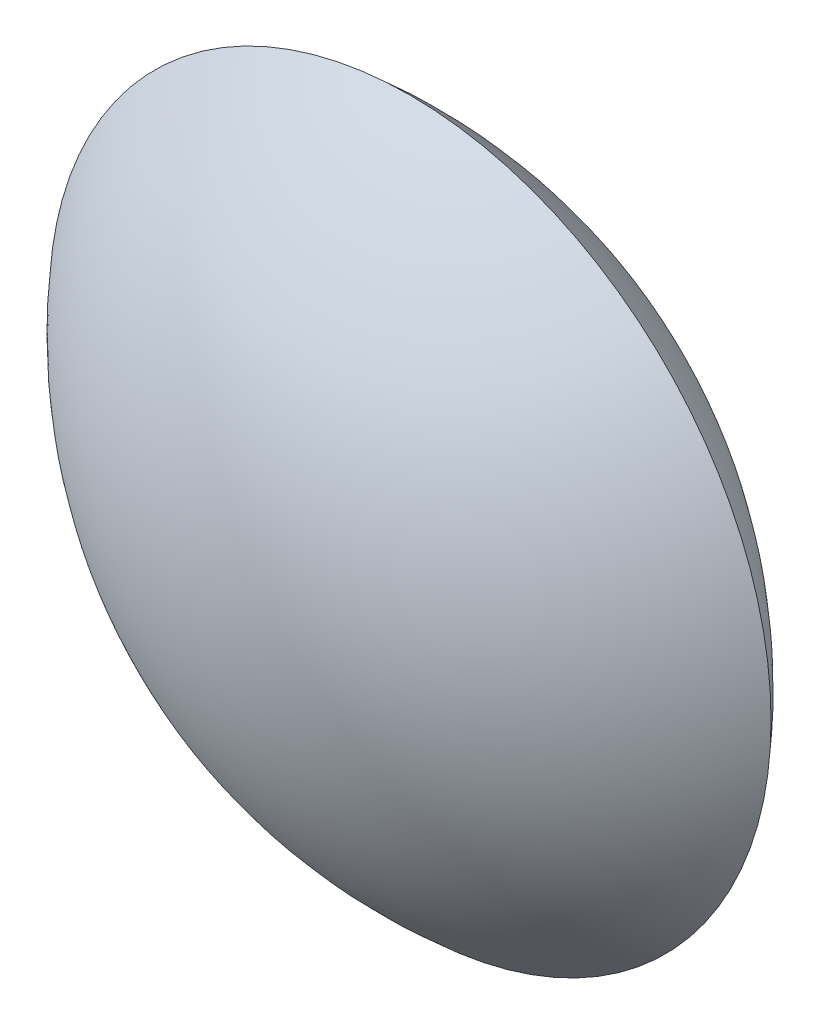
ISO-10303-21;
HEADER;
FILE_DESCRIPTION(('STEP AP214'),'2;1');
FILE_NAME('part.step','',(''),(''),'','','');
FILE_SCHEMA(('AUTOMOTIVE_DESIGN { 1 0 10303 214 1 1 1 1 }'));
ENDSEC;
DATA;
#1=APPLICATION_CONTEXT('core data for automotive mechanical design processes');
#2=APPLICATION_PROTOCOL_DEFINITION('international standard','automotive_design',2000,#1);
#3=PRODUCT_CONTEXT('',#1,'mechanical');
#4=PRODUCT('Part','Part','',(#3));
#5=PRODUCT_RELATED_PRODUCT_CATEGORY('part','',(#4));
#6=PRODUCT_DEFINITION_FORMATION('','',#4);
#7=PRODUCT_DEFINITION_CONTEXT('part definition',#1,'design');
#8=PRODUCT_DEFINITION('design','',#6,#7);
#9=PRODUCT_DEFINITION_SHAPE('','',#8);
#10=(LENGTH_UNIT() NAMED_UNIT(*) SI_UNIT(.MILLI.,.METRE.));
#11=(NAMED_UNIT(*) PLANE_ANGLE_UNIT() SI_UNIT($,.RADIAN.));
#12=(NAMED_UNIT(*) SI_UNIT($,.STERADIAN.) SOLID_ANGLE_UNIT());
#13=UNCERTAINTY_MEASURE_WITH_UNIT(LENGTH_MEASURE(1.E-05),#10,'distance_accuracy_value','');
#14=(GEOMETRIC_REPRESENTATION_CONTEXT(3) GLOBAL_UNCERTAINTY_ASSIGNED_CONTEXT((#13)) GLOBAL_UNIT_ASSIGNED_CONTEXT((#10,
#11,#12)) REPRESENTATION_CONTEXT('',''));
#15=CARTESIAN_POINT('',(0.,0.,0.));
#16=DIRECTION('',(0.,0.,1.));
#17=DIRECTION('',(1.,0.,0.));
#18=AXIS2_PLACEMENT_3D('',#15,#16,#17);
#19=CARTESIAN_POINT('',(0.,0.,130.));
#20=DIRECTION('',(0.,0.,-1.));
#21=DIRECTION('',(1.,0.,0.));
#22=AXIS2_PLACEMENT_3D('',#19,#20,#21);
#23=SPHERICAL_SURFACE('',#22,200.314153269308);
#24=CARTESIAN_POINT('',(0.,0.,0.));
#25=DIRECTION('',(0.,0.,-1.));
#26=DIRECTION('',(-1.,0.,0.));
#27=AXIS2_PLACEMENT_3D('',#24,#25,#26);
#28=CIRCLE('',#27,152.4);
#29=CARTESIAN_POINT('',(-152.4,0.,0.));
#30=VERTEX_POINT('',#29);
#31=EDGE_CURVE('E10',#30,#30,#28,.T.);
#32=ORIENTED_EDGE('',*,*,#31,.T.);
#33=EDGE_LOOP('',(#32));
#34=FACE_BOUND('',#33,.T.);
#35=ADVANCED_FACE('F35',(#34),#23,.T.);
#36=CARTESIAN_POINT('',(0.,0.,-130.));
#37=DIRECTION('',(0.,0.,-1.));
#38=DIRECTION('',(-1.,0.,0.));
#39=AXIS2_PLACEMENT_3D('',#36,#37,#38);
#40=SPHERICAL_SURFACE('',#39,200.314153269308);
#41=ORIENTED_EDGE('',*,*,#31,.F.);
#42=EDGE_LOOP('',(#41));
#43=FACE_BOUND('',#42,.T.);
#44=ADVANCED_FACE('F43',(#43),#40,.T.);
#45=CLOSED_SHELL('',(#35,#44));
#46=MANIFOLD_SOLID_BREP('B2',#45);
#47=ADVANCED_BREP_SHAPE_REPRESENTATION('',(#18,#46),#14);
#48=SHAPE_DEFINITION_REPRESENTATION(#9,#47);
ENDSEC;
END-ISO-10303-21;
